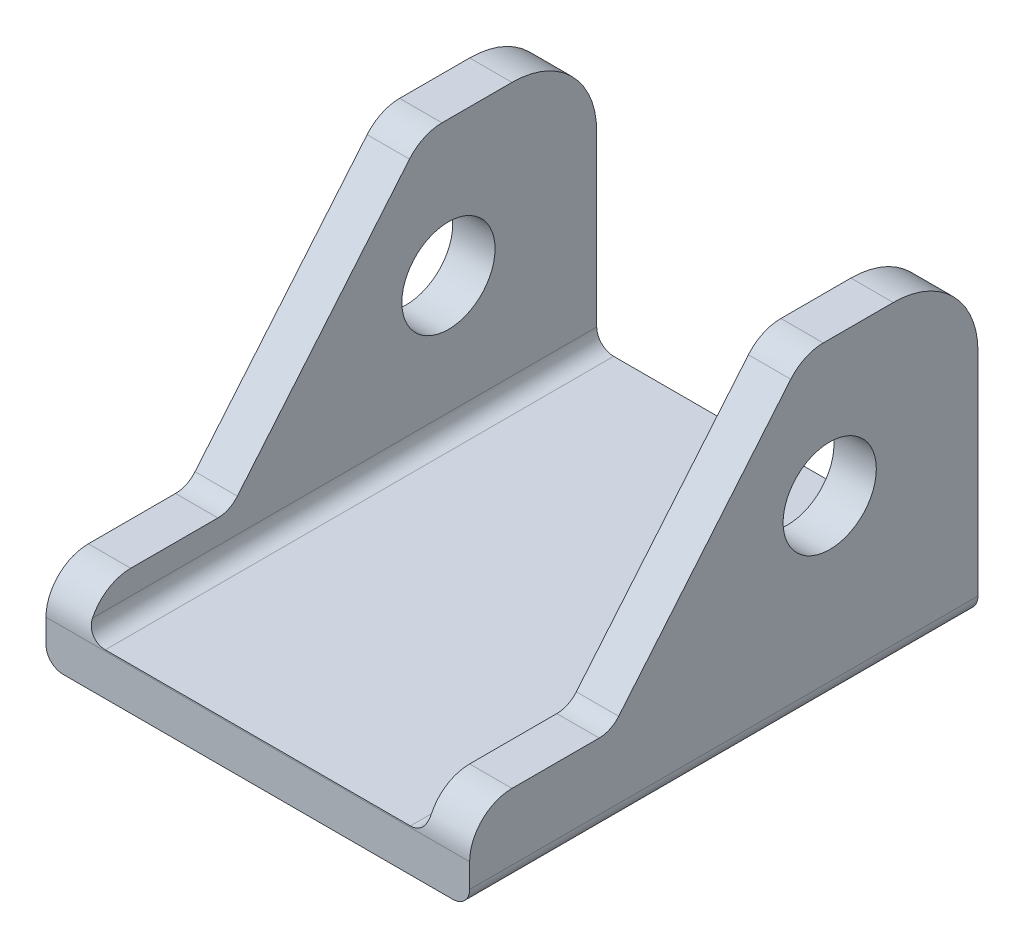
ISO-10303-21;
HEADER;
FILE_DESCRIPTION(('STEP AP214'),'2;1');
FILE_NAME('part.step','',(''),(''),'','','');
FILE_SCHEMA(('AUTOMOTIVE_DESIGN { 1 0 10303 214 1 1 1 1 }'));
ENDSEC;
DATA;
#1=APPLICATION_CONTEXT('core data for automotive mechanical design processes');
#2=APPLICATION_PROTOCOL_DEFINITION('international standard','automotive_design',2000,#1);
#3=PRODUCT_CONTEXT('',#1,'mechanical');
#4=PRODUCT('Part','Part','',(#3));
#5=PRODUCT_RELATED_PRODUCT_CATEGORY('part','',(#4));
#6=PRODUCT_DEFINITION_FORMATION('','',#4);
#7=PRODUCT_DEFINITION_CONTEXT('part definition',#1,'design');
#8=PRODUCT_DEFINITION('design','',#6,#7);
#9=PRODUCT_DEFINITION_SHAPE('','',#8);
#10=(LENGTH_UNIT() NAMED_UNIT(*) SI_UNIT(.MILLI.,.METRE.));
#11=(NAMED_UNIT(*) PLANE_ANGLE_UNIT() SI_UNIT($,.RADIAN.));
#12=(NAMED_UNIT(*) SI_UNIT($,.STERADIAN.) SOLID_ANGLE_UNIT());
#13=UNCERTAINTY_MEASURE_WITH_UNIT(LENGTH_MEASURE(1.E-05),#10,'distance_accuracy_value','');
#14=(GEOMETRIC_REPRESENTATION_CONTEXT(3) GLOBAL_UNCERTAINTY_ASSIGNED_CONTEXT((#13)) GLOBAL_UNIT_ASSIGNED_CONTEXT((#10,
#11,#12)) REPRESENTATION_CONTEXT('',''));
#15=CARTESIAN_POINT('',(0.,0.,0.));
#16=DIRECTION('',(0.,0.,1.));
#17=DIRECTION('',(1.,0.,0.));
#18=AXIS2_PLACEMENT_3D('',#15,#16,#17);
#19=CARTESIAN_POINT('',(-93.9251910485441,-11.2481336624736,60.));
#20=DIRECTION('',(1.,0.,0.));
#21=DIRECTION('',(0.,0.,-1.));
#22=AXIS2_PLACEMENT_3D('',#19,#20,#21);
#23=PLANE('',#22);
#24=CARTESIAN_POINT('',(-93.9251910485441,7.75186633752635,17.5));
#25=DIRECTION('',(1.,0.,0.));
#26=DIRECTION('',(0.,0.,-1.));
#27=AXIS2_PLACEMENT_3D('',#24,#25,#26);
#28=CIRCLE('',#27,5.49999999999999);
#29=CARTESIAN_POINT('',(-93.9251910485441,7.75186633752635,12.));
#30=VERTEX_POINT('',#29);
#31=EDGE_CURVE('E352',#30,#30,#28,.T.);
#32=ORIENTED_EDGE('',*,*,#31,.T.);
#33=EDGE_LOOP('',(#32));
#34=FACE_BOUND('',#33,.T.);
#35=CARTESIAN_POINT('',(-93.9251910485441,18.7518663375264,18.2638664890412));
#36=DIRECTION('',(1.,0.,0.));
#37=DIRECTION('',(0.,0.,-1.));
#38=AXIS2_PLACEMENT_3D('',#35,#36,#37);
#39=CIRCLE('',#38,5.00000000000004);
#40=CARTESIAN_POINT('',(-93.9251910485441,23.7518663375264,18.2638664890412));
#41=VERTEX_POINT('',#40);
#42=CARTESIAN_POINT('',(-93.9251910485441,21.9591391649979,22.0996716209741));
#43=VERTEX_POINT('',#42);
#44=EDGE_CURVE('E346',#41,#43,#39,.T.);
#45=ORIENTED_EDGE('',*,*,#44,.F.);
#46=DIRECTION('',(0.,0.,-1.));
#47=VECTOR('',#46,1.);
#48=CARTESIAN_POINT('',(-93.9251910485441,23.7518663375264,60.));
#49=LINE('',#48,#47);
#50=CARTESIAN_POINT('',(-93.9251910485441,23.7518663375264,10.));
#51=VERTEX_POINT('',#50);
#52=EDGE_CURVE('E427',#41,#51,#49,.T.);
#53=ORIENTED_EDGE('',*,*,#52,.T.);
#54=CARTESIAN_POINT('',(-93.9251910485441,13.7518663375263,10.));
#55=DIRECTION('',(1.,0.,0.));
#56=DIRECTION('',(0.,0.,-1.));
#57=AXIS2_PLACEMENT_3D('',#54,#55,#56);
#58=CIRCLE('',#57,10.);
#59=CARTESIAN_POINT('',(-93.9251910485441,13.7518663375263,0.));
#60=VERTEX_POINT('',#59);
#61=EDGE_CURVE('E325',#51,#60,#58,.F.);
#62=ORIENTED_EDGE('',*,*,#61,.T.);
#63=DIRECTION('',(0.,-1.,0.));
#64=VECTOR('',#63,1.);
#65=CARTESIAN_POINT('',(-93.9251910485441,-11.2481336624736,0.));
#66=LINE('',#65,#64);
#67=CARTESIAN_POINT('',(-93.9251910485441,-11.2481336624737,0.));
#68=VERTEX_POINT('',#67);
#69=EDGE_CURVE('E365',#60,#68,#66,.T.);
#70=ORIENTED_EDGE('',*,*,#69,.T.);
#71=DIRECTION('',(0.,0.,-1.));
#72=VECTOR('',#71,1.);
#73=CARTESIAN_POINT('',(-93.9251910485441,-11.2481336624737,60.));
#74=LINE('',#73,#72);
#75=CARTESIAN_POINT('',(-93.9251910485441,-11.2481336624737,60.));
#76=VERTEX_POINT('',#75);
#77=EDGE_CURVE('E424',#76,#68,#74,.T.);
#78=ORIENTED_EDGE('',*,*,#77,.F.);
#79=DIRECTION('',(0.,-1.,0.));
#80=VECTOR('',#79,1.);
#81=CARTESIAN_POINT('',(-93.9251910485441,-11.2481336624736,60.));
#82=LINE('',#81,#80);
#83=CARTESIAN_POINT('',(-93.9251910485441,-8.40963792703764,60.));
#84=VERTEX_POINT('',#83);
#85=EDGE_CURVE('E366',#84,#76,#82,.T.);
#86=ORIENTED_EDGE('',*,*,#85,.F.);
#87=CARTESIAN_POINT('',(-93.9251910485441,-8.40963792703764,55.));
#88=DIRECTION('',(1.,0.,0.));
#89=DIRECTION('',(0.,0.,-1.));
#90=AXIS2_PLACEMENT_3D('',#87,#88,#89);
#91=CIRCLE('',#90,5.);
#92=CARTESIAN_POINT('',(-93.9251910485441,-3.40963792703763,55.));
#93=VERTEX_POINT('',#92);
#94=EDGE_CURVE('E447',#93,#84,#91,.T.);
#95=ORIENTED_EDGE('',*,*,#94,.F.);
#96=DIRECTION('',(0.,0.,1.));
#97=VECTOR('',#96,1.);
#98=CARTESIAN_POINT('',(-93.9251910485441,-3.40963792703763,60.));
#99=LINE('',#98,#97);
#100=CARTESIAN_POINT('',(-93.9251910485441,-3.40963792703763,44.7136386937328));
#101=VERTEX_POINT('',#100);
#102=EDGE_CURVE('E210',#101,#93,#99,.T.);
#103=ORIENTED_EDGE('',*,*,#102,.F.);
#104=CARTESIAN_POINT('',(-93.9251910485441,-0.409637927037632,44.7136386937328));
#105=DIRECTION('',(1.,0.,0.));
#106=DIRECTION('',(0.,0.,-1.));
#107=AXIS2_PLACEMENT_3D('',#104,#105,#106);
#108=CIRCLE('',#107,3.);
#109=CARTESIAN_POINT('',(-93.9251910485441,-2.33400162352049,42.4121556145731));
#110=VERTEX_POINT('',#109);
#111=EDGE_CURVE('E53',#110,#101,#108,.F.);
#112=ORIENTED_EDGE('',*,*,#111,.F.);
#113=DIRECTION('',(0.,-0.767161026386595,0.641454565494289));
#114=VECTOR('',#113,1.);
#115=CARTESIAN_POINT('',(-93.9251910485441,-16.2352492263773,54.0355546588638));
#116=LINE('',#115,#114);
#117=EDGE_CURVE('E48',#43,#110,#116,.T.);
#118=ORIENTED_EDGE('',*,*,#117,.F.);
#119=EDGE_LOOP('',(#45,#53,#62,#70,#78,#86,#95,#103,#112,#118));
#120=FACE_BOUND('',#119,.T.);
#121=ADVANCED_FACE('F33',(#34,#120),#23,.F.);
#122=CARTESIAN_POINT('',(-43.9251910485441,-11.2481336624736,60.));
#123=DIRECTION('',(-1.,0.,0.));
#124=DIRECTION('',(0.,0.,1.));
#125=AXIS2_PLACEMENT_3D('',#122,#123,#124);
#126=PLANE('',#125);
#127=CARTESIAN_POINT('',(-43.9251910485441,7.75186633752635,17.5));
#128=DIRECTION('',(1.,0.,0.));
#129=DIRECTION('',(0.,0.,-1.));
#130=AXIS2_PLACEMENT_3D('',#127,#128,#129);
#131=CIRCLE('',#130,5.49999999999999);
#132=CARTESIAN_POINT('',(-43.9251910485441,7.75186633752635,12.));
#133=VERTEX_POINT('',#132);
#134=EDGE_CURVE('E348',#133,#133,#131,.T.);
#135=ORIENTED_EDGE('',*,*,#134,.F.);
#136=EDGE_LOOP('',(#135));
#137=FACE_BOUND('',#136,.T.);
#138=CARTESIAN_POINT('',(-43.9251910485441,18.7518663375264,18.2638664890412));
#139=DIRECTION('',(-1.,0.,0.));
#140=DIRECTION('',(0.,0.,1.));
#141=AXIS2_PLACEMENT_3D('',#138,#139,#140);
#142=CIRCLE('',#141,5.00000000000004);
#143=CARTESIAN_POINT('',(-43.9251910485441,21.9591391649979,22.0996716209741));
#144=VERTEX_POINT('',#143);
#145=CARTESIAN_POINT('',(-43.9251910485441,23.7518663375264,18.2638664890412));
#146=VERTEX_POINT('',#145);
#147=EDGE_CURVE('E349',#144,#146,#142,.T.);
#148=ORIENTED_EDGE('',*,*,#147,.F.);
#149=DIRECTION('',(0.,0.767161026386595,-0.641454565494289));
#150=VECTOR('',#149,1.);
#151=CARTESIAN_POINT('',(-43.9251910485441,-16.2352492263773,54.0355546588638));
#152=LINE('',#151,#150);
#153=CARTESIAN_POINT('',(-43.9251910485441,-2.33400162352049,42.4121556145731));
#154=VERTEX_POINT('',#153);
#155=EDGE_CURVE('E467',#154,#144,#152,.T.);
#156=ORIENTED_EDGE('',*,*,#155,.F.);
#157=CARTESIAN_POINT('',(-43.9251910485441,-0.409637927037632,44.7136386937328));
#158=DIRECTION('',(-1.,0.,0.));
#159=DIRECTION('',(0.,0.,1.));
#160=AXIS2_PLACEMENT_3D('',#157,#158,#159);
#161=CIRCLE('',#160,3.);
#162=CARTESIAN_POINT('',(-43.9251910485441,-3.40963792703763,44.7136386937328));
#163=VERTEX_POINT('',#162);
#164=EDGE_CURVE('E460',#163,#154,#161,.F.);
#165=ORIENTED_EDGE('',*,*,#164,.F.);
#166=DIRECTION('',(0.,0.,-1.));
#167=VECTOR('',#166,1.);
#168=CARTESIAN_POINT('',(-43.9251910485441,-3.40963792703763,60.));
#169=LINE('',#168,#167);
#170=CARTESIAN_POINT('',(-43.9251910485441,-3.40963792703763,55.));
#171=VERTEX_POINT('',#170);
#172=EDGE_CURVE('E453',#171,#163,#169,.T.);
#173=ORIENTED_EDGE('',*,*,#172,.F.);
#174=CARTESIAN_POINT('',(-43.9251910485441,-8.40963792703764,55.));
#175=DIRECTION('',(-1.,0.,0.));
#176=DIRECTION('',(0.,0.,1.));
#177=AXIS2_PLACEMENT_3D('',#174,#175,#176);
#178=CIRCLE('',#177,5.);
#179=CARTESIAN_POINT('',(-43.9251910485441,-8.40963792703764,60.));
#180=VERTEX_POINT('',#179);
#181=EDGE_CURVE('E446',#180,#171,#178,.T.);
#182=ORIENTED_EDGE('',*,*,#181,.F.);
#183=DIRECTION('',(0.,1.,0.));
#184=VECTOR('',#183,1.);
#185=CARTESIAN_POINT('',(-43.9251910485441,-11.2481336624736,60.));
#186=LINE('',#185,#184);
#187=CARTESIAN_POINT('',(-43.9251910485441,-11.2481336624736,60.));
#188=VERTEX_POINT('',#187);
#189=EDGE_CURVE('E375',#188,#180,#186,.T.);
#190=ORIENTED_EDGE('',*,*,#189,.F.);
#191=DIRECTION('',(0.,0.,-1.));
#192=VECTOR('',#191,1.);
#193=CARTESIAN_POINT('',(-43.9251910485441,-11.2481336624736,60.));
#194=LINE('',#193,#192);
#195=CARTESIAN_POINT('',(-43.9251910485441,-11.2481336624736,0.));
#196=VERTEX_POINT('',#195);
#197=EDGE_CURVE('E415',#188,#196,#194,.T.);
#198=ORIENTED_EDGE('',*,*,#197,.T.);
#199=DIRECTION('',(0.,1.,0.));
#200=VECTOR('',#199,1.);
#201=CARTESIAN_POINT('',(-43.9251910485441,-11.2481336624736,0.));
#202=LINE('',#201,#200);
#203=CARTESIAN_POINT('',(-43.9251910485441,13.7518663375263,0.));
#204=VERTEX_POINT('',#203);
#205=EDGE_CURVE('E386',#196,#204,#202,.T.);
#206=ORIENTED_EDGE('',*,*,#205,.T.);
#207=CARTESIAN_POINT('',(-43.9251910485441,13.7518663375263,10.));
#208=DIRECTION('',(-1.,0.,0.));
#209=DIRECTION('',(0.,0.,1.));
#210=AXIS2_PLACEMENT_3D('',#207,#208,#209);
#211=CIRCLE('',#210,10.);
#212=CARTESIAN_POINT('',(-43.9251910485441,23.7518663375264,10.));
#213=VERTEX_POINT('',#212);
#214=EDGE_CURVE('E314',#204,#213,#211,.F.);
#215=ORIENTED_EDGE('',*,*,#214,.T.);
#216=DIRECTION('',(0.,0.,-1.));
#217=VECTOR('',#216,1.);
#218=CARTESIAN_POINT('',(-43.9251910485441,23.7518663375264,60.));
#219=LINE('',#218,#217);
#220=EDGE_CURVE('E413',#146,#213,#219,.T.);
#221=ORIENTED_EDGE('',*,*,#220,.F.);
#222=EDGE_LOOP('',(#148,#156,#165,#173,#182,#190,#198,#206,#215,#221));
#223=FACE_BOUND('',#222,.T.);
#224=ADVANCED_FACE('F268',(#137,#223),#126,.F.);
#225=CARTESIAN_POINT('',(-48.9251910485441,-6.24813366247364,60.));
#226=DIRECTION('',(1.,0.,0.));
#227=DIRECTION('',(0.,0.,-1.));
#228=AXIS2_PLACEMENT_3D('',#225,#226,#227);
#229=PLANE('',#228);
#230=CARTESIAN_POINT('',(-48.9251910485441,7.75186633752635,17.5));
#231=DIRECTION('',(1.,0.,0.));
#232=DIRECTION('',(0.,0.,-1.));
#233=AXIS2_PLACEMENT_3D('',#230,#231,#232);
#234=CIRCLE('',#233,5.49999999999999);
#235=CARTESIAN_POINT('',(-48.9251910485441,7.75186633752635,12.));
#236=VERTEX_POINT('',#235);
#237=EDGE_CURVE('E361',#236,#236,#234,.T.);
#238=ORIENTED_EDGE('',*,*,#237,.T.);
#239=EDGE_LOOP('',(#238));
#240=FACE_BOUND('',#239,.T.);
#241=CARTESIAN_POINT('',(-48.9251910485441,18.7518663375264,18.2638664890412));
#242=DIRECTION('',(1.,0.,0.));
#243=DIRECTION('',(0.,0.,-1.));
#244=AXIS2_PLACEMENT_3D('',#241,#242,#243);
#245=CIRCLE('',#244,5.00000000000004);
#246=CARTESIAN_POINT('',(-48.9251910485441,23.7518663375264,18.2638664890412));
#247=VERTEX_POINT('',#246);
#248=CARTESIAN_POINT('',(-48.9251910485441,21.9591391649979,22.0996716209741));
#249=VERTEX_POINT('',#248);
#250=EDGE_CURVE('E355',#247,#249,#245,.T.);
#251=ORIENTED_EDGE('',*,*,#250,.F.);
#252=DIRECTION('',(0.,0.,-1.));
#253=VECTOR('',#252,1.);
#254=CARTESIAN_POINT('',(-48.9251910485441,23.7518663375264,60.));
#255=LINE('',#254,#253);
#256=CARTESIAN_POINT('',(-48.9251910485441,23.7518663375264,10.));
#257=VERTEX_POINT('',#256);
#258=EDGE_CURVE('E411',#247,#257,#255,.T.);
#259=ORIENTED_EDGE('',*,*,#258,.T.);
#260=CARTESIAN_POINT('',(-48.9251910485441,13.7518663375263,10.));
#261=DIRECTION('',(1.,0.,0.));
#262=DIRECTION('',(0.,0.,-1.));
#263=AXIS2_PLACEMENT_3D('',#260,#261,#262);
#264=CIRCLE('',#263,10.);
#265=CARTESIAN_POINT('',(-48.9251910485441,13.7518663375263,0.));
#266=VERTEX_POINT('',#265);
#267=EDGE_CURVE('E327',#257,#266,#264,.F.);
#268=ORIENTED_EDGE('',*,*,#267,.T.);
#269=DIRECTION('',(0.,-1.,0.));
#270=VECTOR('',#269,1.);
#271=CARTESIAN_POINT('',(-48.9251910485441,-6.24813366247364,0.));
#272=LINE('',#271,#270);
#273=CARTESIAN_POINT('',(-48.9251910485441,-6.24813366247365,0.));
#274=VERTEX_POINT('',#273);
#275=EDGE_CURVE('E388',#266,#274,#272,.T.);
#276=ORIENTED_EDGE('',*,*,#275,.T.);
#277=DIRECTION('',(0.,0.,-1.));
#278=VECTOR('',#277,1.);
#279=CARTESIAN_POINT('',(-48.9251910485441,-6.24813366247365,60.));
#280=LINE('',#279,#278);
#281=CARTESIAN_POINT('',(-48.9251910485441,-6.24813366247365,59.5086471711892));
#282=VERTEX_POINT('',#281);
#283=EDGE_CURVE('E409',#282,#274,#280,.T.);
#284=ORIENTED_EDGE('',*,*,#283,.F.);
#285=CARTESIAN_POINT('',(-48.9251910485441,-8.40963792703764,55.));
#286=DIRECTION('',(1.,0.,0.));
#287=DIRECTION('',(0.,0.,-1.));
#288=AXIS2_PLACEMENT_3D('',#285,#286,#287);
#289=CIRCLE('',#288,5.);
#290=CARTESIAN_POINT('',(-48.9251910485441,-3.40963792703763,55.));
#291=VERTEX_POINT('',#290);
#292=EDGE_CURVE('E257',#291,#282,#289,.T.);
#293=ORIENTED_EDGE('',*,*,#292,.F.);
#294=DIRECTION('',(0.,0.,1.));
#295=VECTOR('',#294,1.);
#296=CARTESIAN_POINT('',(-48.9251910485441,-3.40963792703763,60.));
#297=LINE('',#296,#295);
#298=CARTESIAN_POINT('',(-48.9251910485441,-3.40963792703763,44.7136386937328));
#299=VERTEX_POINT('',#298);
#300=EDGE_CURVE('E449',#299,#291,#297,.T.);
#301=ORIENTED_EDGE('',*,*,#300,.F.);
#302=CARTESIAN_POINT('',(-48.9251910485441,-0.409637927037632,44.7136386937328));
#303=DIRECTION('',(1.,0.,0.));
#304=DIRECTION('',(0.,0.,-1.));
#305=AXIS2_PLACEMENT_3D('',#302,#303,#304);
#306=CIRCLE('',#305,3.);
#307=CARTESIAN_POINT('',(-48.9251910485441,-2.33400162352049,42.4121556145731));
#308=VERTEX_POINT('',#307);
#309=EDGE_CURVE('E457',#308,#299,#306,.F.);
#310=ORIENTED_EDGE('',*,*,#309,.F.);
#311=DIRECTION('',(0.,-0.767161026386595,0.641454565494289));
#312=VECTOR('',#311,1.);
#313=CARTESIAN_POINT('',(-48.9251910485441,-13.2925690243447,51.575059944639));
#314=LINE('',#313,#312);
#315=EDGE_CURVE('E464',#249,#308,#314,.T.);
#316=ORIENTED_EDGE('',*,*,#315,.F.);
#317=EDGE_LOOP('',(#251,#259,#268,#276,#284,#293,#301,#310,#316));
#318=FACE_BOUND('',#317,.T.);
#319=ADVANCED_FACE('F264',(#240,#318),#229,.F.);
#320=CARTESIAN_POINT('',(-50.9251910485441,-6.24813366247365,60.));
#321=DIRECTION('',(0.,0.,-1.));
#322=DIRECTION('',(-1.,0.,0.));
#323=AXIS2_PLACEMENT_3D('',#320,#321,#322);
#324=CYLINDRICAL_SURFACE('',#323,2.);
#325=CARTESIAN_POINT('',(-48.9251910485441,-6.24813366247365,59.5086471711892));
#326=CARTESIAN_POINT('',(-48.9251858279574,-6.29925158291446,59.5331623247386));
#327=CARTESIAN_POINT('',(-48.9271512068706,-6.35080301802406,59.5567990272246));
#328=CARTESIAN_POINT('',(-48.9351813542254,-6.4544317763055,59.6022115280821));
#329=CARTESIAN_POINT('',(-48.9412481172607,-6.50650934320252,59.6239864152048));
#330=CARTESIAN_POINT('',(-48.9576482900264,-6.61085446674956,59.6655693990258));
#331=CARTESIAN_POINT('',(-48.9679862513358,-6.66312216693954,59.6853753695408));
#332=CARTESIAN_POINT('',(-48.9930137289147,-6.76733290544826,59.7229131946399));
#333=CARTESIAN_POINT('',(-49.0077024703024,-6.81927599989918,59.7406454177785));
#334=CARTESIAN_POINT('',(-49.0585115706969,-6.97430059994173,59.7907790495721));
#335=CARTESIAN_POINT('',(-49.1013362318181,-7.07632240709126,59.8200169471265));
#336=CARTESIAN_POINT('',(-49.2042792554827,-7.27322030647919,59.8702058638573));
#337=CARTESIAN_POINT('',(-49.2643756509398,-7.36810528350626,59.8911673295423));
#338=CARTESIAN_POINT('',(-49.3970308688227,-7.54279772429905,59.9250504742515));
#339=CARTESIAN_POINT('',(-49.4688265198361,-7.62311873332185,59.9383184475655));
#340=CARTESIAN_POINT('',(-49.6248376640662,-7.77151129368799,59.9596805565257));
#341=CARTESIAN_POINT('',(-49.7090594765108,-7.8395765731386,59.9677720484745));
#342=CARTESIAN_POINT('',(-49.8881051774763,-7.96168873087447,59.9802757420668));
#343=CARTESIAN_POINT('',(-49.982990863911,-8.01564716216324,59.9846650966699));
#344=CARTESIAN_POINT('',(-50.1803233596858,-8.10743722342262,59.9910713392175));
#345=CARTESIAN_POINT('',(-50.2827684441001,-8.14527251915009,59.9930887666271));
#346=CARTESIAN_POINT('',(-50.4749979127183,-8.19891859416786,59.9956202169407));
#347=CARTESIAN_POINT('',(-50.5640614480152,-8.21734265358092,59.9963281951281));
#348=CARTESIAN_POINT('',(-50.7438048210362,-8.24196347177263,59.9971908023903));
#349=CARTESIAN_POINT('',(-50.8344835569718,-8.24816826602773,59.9973457951668));
#350=CARTESIAN_POINT('',(-50.9251910485441,-8.24813366247365,59.997390956542));
#351=B_SPLINE_CURVE_WITH_KNOTS('',3,(#325,#326,#327,#328,#329,#330,#331,#332,#333,#334,#335,
#336,#337,#338,#339,#340,#341,#342,#343,#344,#345,#346,#347,#348,#349,#350),.UNSPECIFIED.,.F.,
.F.,(4,2,2,2,2,2,2,2,2,2,2,2,4),(0.,0.17005031612191,0.340183391021295,0.510498236842748,
0.680782767500137,1.02217120620498,1.3631273564556,1.68722414142514,2.01148631504457,
2.33773526643185,2.66391000221575,2.93594663159866,3.20780430792564),.UNSPECIFIED.);
#352=CARTESIAN_POINT('',(-50.9251910485441,-8.24813366247365,59.997390956542));
#353=VERTEX_POINT('',#352);
#354=EDGE_CURVE('E249',#282,#353,#351,.T.);
#355=ORIENTED_EDGE('',*,*,#354,.F.);
#356=ORIENTED_EDGE('',*,*,#283,.T.);
#357=CARTESIAN_POINT('',(-50.9251910485441,-6.24813366247365,0.));
#358=DIRECTION('',(0.,0.,-1.));
#359=DIRECTION('',(1.,0.,0.));
#360=AXIS2_PLACEMENT_3D('',#357,#358,#359);
#361=CIRCLE('',#360,2.);
#362=CARTESIAN_POINT('',(-50.9251910485441,-8.24813366247365,0.));
#363=VERTEX_POINT('',#362);
#364=EDGE_CURVE('E391',#274,#363,#361,.T.);
#365=ORIENTED_EDGE('',*,*,#364,.T.);
#366=DIRECTION('',(0.,0.,-1.));
#367=VECTOR('',#366,1.);
#368=CARTESIAN_POINT('',(-50.9251910485441,-8.24813366247365,60.));
#369=LINE('',#368,#367);
#370=EDGE_CURVE('E407',#353,#363,#369,.T.);
#371=ORIENTED_EDGE('',*,*,#370,.F.);
#372=EDGE_LOOP('',(#355,#356,#365,#371));
#373=FACE_BOUND('',#372,.T.);
#374=ADVANCED_FACE('F259',(#373),#324,.F.);
#375=CARTESIAN_POINT('',(-86.9251910485441,-8.24813366247365,60.));
#376=DIRECTION('',(0.,-1.,0.));
#377=DIRECTION('',(0.,0.,-1.));
#378=AXIS2_PLACEMENT_3D('',#375,#376,#377);
#379=PLANE('',#378);
#380=DIRECTION('',(1.,0.,0.));
#381=VECTOR('',#380,1.);
#382=CARTESIAN_POINT('',(-201.954411632606,-8.24813366247365,59.997390956542));
#383=LINE('',#382,#381);
#384=CARTESIAN_POINT('',(-86.9251910485441,-8.24813366247365,59.997390956542));
#385=VERTEX_POINT('',#384);
#386=EDGE_CURVE('E237',#353,#385,#383,.F.);
#387=ORIENTED_EDGE('',*,*,#386,.F.);
#388=ORIENTED_EDGE('',*,*,#370,.T.);
#389=DIRECTION('',(-1.,0.,0.));
#390=VECTOR('',#389,1.);
#391=CARTESIAN_POINT('',(-86.9251910485441,-8.24813366247365,0.));
#392=LINE('',#391,#390);
#393=CARTESIAN_POINT('',(-86.9251910485441,-8.24813366247365,0.));
#394=VERTEX_POINT('',#393);
#395=EDGE_CURVE('E394',#363,#394,#392,.T.);
#396=ORIENTED_EDGE('',*,*,#395,.T.);
#397=DIRECTION('',(0.,0.,-1.));
#398=VECTOR('',#397,1.);
#399=CARTESIAN_POINT('',(-86.9251910485441,-8.24813366247365,60.));
#400=LINE('',#399,#398);
#401=EDGE_CURVE('E405',#385,#394,#400,.T.);
#402=ORIENTED_EDGE('',*,*,#401,.F.);
#403=EDGE_LOOP('',(#387,#388,#396,#402));
#404=FACE_BOUND('',#403,.T.);
#405=ADVANCED_FACE('F263',(#404),#379,.F.);
#406=CARTESIAN_POINT('',(-86.9251910485441,-6.24813366247365,60.));
#407=DIRECTION('',(0.,0.,-1.));
#408=DIRECTION('',(-1.,0.,0.));
#409=AXIS2_PLACEMENT_3D('',#406,#407,#408);
#410=CYLINDRICAL_SURFACE('',#409,2.);
#411=CARTESIAN_POINT('',(-86.9251910485441,-8.24813366247365,59.997390956542));
#412=CARTESIAN_POINT('',(-86.9812711668975,-8.24813327190805,59.9973855418156));
#413=CARTESIAN_POINT('',(-87.0373245218461,-8.24577343707318,59.9973152911568));
#414=CARTESIAN_POINT('',(-87.1490332400256,-8.23635895740011,59.9969998076121));
#415=CARTESIAN_POINT('',(-87.2046886155049,-8.22930445768085,59.9967545801349));
#416=CARTESIAN_POINT('',(-87.3704058709195,-8.20115871113855,59.9956893695156));
#417=CARTESIAN_POINT('',(-87.4793630818956,-8.17308507890719,59.9945400739284));
#418=CARTESIAN_POINT('',(-87.6910287339406,-8.09910257991013,59.9904834356634));
#419=CARTESIAN_POINT('',(-87.7937332648341,-8.0531826826677,59.987575005074));
#420=CARTESIAN_POINT('',(-87.9899107151172,-7.94486968668109,59.9786475487793));
#421=CARTESIAN_POINT('',(-88.0833855363495,-7.88247999142165,59.9726291655001));
#422=CARTESIAN_POINT('',(-88.2576426881013,-7.74375261547649,59.9559481940562));
#423=CARTESIAN_POINT('',(-88.338520998429,-7.66753107555153,59.9453233235516));
#424=CARTESIAN_POINT('',(-88.4860987217871,-7.50341577601849,59.9178917468544));
#425=CARTESIAN_POINT('',(-88.5528048122846,-7.41552754521565,59.9010879621928));
#426=CARTESIAN_POINT('',(-88.6688052072329,-7.23360526141879,59.8605965957802));
#427=CARTESIAN_POINT('',(-88.7184987296861,-7.13978401029801,59.8370947007016));
#428=CARTESIAN_POINT('',(-88.8019251200691,-6.94733011365624,59.7824319127128));
#429=CARTESIAN_POINT('',(-88.8356474086825,-6.84869432656981,59.7512659638506));
#430=CARTESIAN_POINT('',(-88.8830580621364,-6.66557519735472,59.6868058543229));
#431=CARTESIAN_POINT('',(-88.8990558800358,-6.58129294880388,59.6546081816976));
#432=CARTESIAN_POINT('',(-88.9148540030958,-6.45555936360914,59.6025686270407));
#433=CARTESIAN_POINT('',(-88.9187537568442,-6.41379567462458,59.5846138397827));
#434=CARTESIAN_POINT('',(-88.9239222189301,-6.33064414444076,59.5475113940815));
#435=CARTESIAN_POINT('',(-88.9251913539991,-6.28925624336692,59.5283639296301));
#436=CARTESIAN_POINT('',(-88.9251910485441,-6.24813366247363,59.5086471711892));
#437=B_SPLINE_CURVE_WITH_KNOTS('',3,(#411,#412,#413,#414,#415,#416,#417,#418,#419,#420,#421,
#422,#423,#424,#425,#426,#427,#428,#429,#430,#431,#432,#433,#434,#435,#436),.UNSPECIFIED.,.F.,
.F.,(4,2,2,2,2,2,2,2,2,2,2,2,4),(0.,0.168137462911748,0.336269728690209,0.672107132004828,
1.00815244175137,1.34412836200262,1.67740380015736,2.01052186032126,2.33517884675307,
2.66005058564638,2.93407719960672,3.07087572360903,3.20765205480597),.UNSPECIFIED.);
#438=CARTESIAN_POINT('',(-88.9251910485441,-6.24813366247364,59.5086471711892));
#439=VERTEX_POINT('',#438);
#440=EDGE_CURVE('E205',#385,#439,#437,.T.);
#441=ORIENTED_EDGE('',*,*,#440,.F.);
#442=ORIENTED_EDGE('',*,*,#401,.T.);
#443=CARTESIAN_POINT('',(-86.9251910485441,-6.24813366247365,0.));
#444=DIRECTION('',(0.,0.,-1.));
#445=DIRECTION('',(-1.,0.,0.));
#446=AXIS2_PLACEMENT_3D('',#443,#444,#445);
#447=CIRCLE('',#446,2.);
#448=CARTESIAN_POINT('',(-88.9251910485441,-6.24813366247364,0.));
#449=VERTEX_POINT('',#448);
#450=EDGE_CURVE('E397',#394,#449,#447,.T.);
#451=ORIENTED_EDGE('',*,*,#450,.T.);
#452=DIRECTION('',(0.,0.,-1.));
#453=VECTOR('',#452,1.);
#454=CARTESIAN_POINT('',(-88.9251910485441,-6.24813366247364,60.));
#455=LINE('',#454,#453);
#456=EDGE_CURVE('E403',#439,#449,#455,.T.);
#457=ORIENTED_EDGE('',*,*,#456,.F.);
#458=EDGE_LOOP('',(#441,#442,#451,#457));
#459=FACE_BOUND('',#458,.T.);
#460=ADVANCED_FACE('F239',(#459),#410,.F.);
#461=CARTESIAN_POINT('',(-88.9251910485441,-6.24813366247364,60.));
#462=DIRECTION('',(-1.,0.,0.));
#463=DIRECTION('',(0.,0.,1.));
#464=AXIS2_PLACEMENT_3D('',#461,#462,#463);
#465=PLANE('',#464);
#466=CARTESIAN_POINT('',(-88.9251910485441,7.75186633752635,17.5));
#467=DIRECTION('',(-1.,0.,0.));
#468=DIRECTION('',(0.,0.,1.));
#469=AXIS2_PLACEMENT_3D('',#466,#467,#468);
#470=CIRCLE('',#469,5.49999999999999);
#471=CARTESIAN_POINT('',(-88.9251910485441,7.75186633752635,23.));
#472=VERTEX_POINT('',#471);
#473=EDGE_CURVE('E362',#472,#472,#470,.T.);
#474=ORIENTED_EDGE('',*,*,#473,.T.);
#475=EDGE_LOOP('',(#474));
#476=FACE_BOUND('',#475,.T.);
#477=CARTESIAN_POINT('',(-88.9251910485441,18.7518663375264,18.2638664890412));
#478=DIRECTION('',(-1.,0.,0.));
#479=DIRECTION('',(0.,0.,1.));
#480=AXIS2_PLACEMENT_3D('',#477,#478,#479);
#481=CIRCLE('',#480,5.00000000000004);
#482=CARTESIAN_POINT('',(-88.9251910485441,21.9591391649979,22.0996716209741));
#483=VERTEX_POINT('',#482);
#484=CARTESIAN_POINT('',(-88.9251910485441,23.7518663375264,18.2638664890412));
#485=VERTEX_POINT('',#484);
#486=EDGE_CURVE('E11',#483,#485,#481,.T.);
#487=ORIENTED_EDGE('',*,*,#486,.F.);
#488=DIRECTION('',(0.,0.767161026386595,-0.641454565494289));
#489=VECTOR('',#488,1.);
#490=CARTESIAN_POINT('',(-88.9251910485441,-13.2925690243447,51.575059944639));
#491=LINE('',#490,#489);
#492=CARTESIAN_POINT('',(-88.9251910485441,-2.33400162352049,42.4121556145731));
#493=VERTEX_POINT('',#492);
#494=EDGE_CURVE('E41',#493,#483,#491,.T.);
#495=ORIENTED_EDGE('',*,*,#494,.F.);
#496=CARTESIAN_POINT('',(-88.9251910485441,-0.409637927037632,44.7136386937328));
#497=DIRECTION('',(-1.,0.,0.));
#498=DIRECTION('',(0.,0.,1.));
#499=AXIS2_PLACEMENT_3D('',#496,#497,#498);
#500=CIRCLE('',#499,3.);
#501=CARTESIAN_POINT('',(-88.9251910485441,-3.40963792703763,44.7136386937328));
#502=VERTEX_POINT('',#501);
#503=EDGE_CURVE('E191',#502,#493,#500,.F.);
#504=ORIENTED_EDGE('',*,*,#503,.F.);
#505=DIRECTION('',(0.,0.,-1.));
#506=VECTOR('',#505,1.);
#507=CARTESIAN_POINT('',(-88.9251910485441,-3.40963792703763,60.));
#508=LINE('',#507,#506);
#509=CARTESIAN_POINT('',(-88.9251910485441,-3.40963792703763,55.));
#510=VERTEX_POINT('',#509);
#511=EDGE_CURVE('E185',#510,#502,#508,.T.);
#512=ORIENTED_EDGE('',*,*,#511,.F.);
#513=CARTESIAN_POINT('',(-88.9251910485441,-8.40963792703764,55.));
#514=DIRECTION('',(-1.,0.,0.));
#515=DIRECTION('',(0.,0.,1.));
#516=AXIS2_PLACEMENT_3D('',#513,#514,#515);
#517=CIRCLE('',#516,5.);
#518=EDGE_CURVE('E188',#439,#510,#517,.T.);
#519=ORIENTED_EDGE('',*,*,#518,.F.);
#520=ORIENTED_EDGE('',*,*,#456,.T.);
#521=DIRECTION('',(0.,1.,0.));
#522=VECTOR('',#521,1.);
#523=CARTESIAN_POINT('',(-88.9251910485441,-6.24813366247364,0.));
#524=LINE('',#523,#522);
#525=CARTESIAN_POINT('',(-88.9251910485441,13.7518663375263,0.));
#526=VERTEX_POINT('',#525);
#527=EDGE_CURVE('E369',#449,#526,#524,.T.);
#528=ORIENTED_EDGE('',*,*,#527,.T.);
#529=CARTESIAN_POINT('',(-88.9251910485441,13.7518663375263,10.));
#530=DIRECTION('',(-1.,0.,0.));
#531=DIRECTION('',(0.,0.,1.));
#532=AXIS2_PLACEMENT_3D('',#529,#530,#531);
#533=CIRCLE('',#532,10.);
#534=CARTESIAN_POINT('',(-88.9251910485441,23.7518663375264,10.));
#535=VERTEX_POINT('',#534);
#536=EDGE_CURVE('E334',#526,#535,#533,.F.);
#537=ORIENTED_EDGE('',*,*,#536,.T.);
#538=DIRECTION('',(0.,0.,-1.));
#539=VECTOR('',#538,1.);
#540=CARTESIAN_POINT('',(-88.9251910485441,23.7518663375264,60.));
#541=LINE('',#540,#539);
#542=EDGE_CURVE('E378',#485,#535,#541,.T.);
#543=ORIENTED_EDGE('',*,*,#542,.F.);
#544=EDGE_LOOP('',(#487,#495,#504,#512,#519,#520,#528,#537,#543));
#545=FACE_BOUND('',#544,.T.);
#546=ADVANCED_FACE('F187',(#476,#545),#465,.F.);
#547=CARTESIAN_POINT('',(-86.9251910485441,-6.24813366247365,60.));
#548=DIRECTION('',(0.,0.,-1.));
#549=DIRECTION('',(-1.,0.,0.));
#550=AXIS2_PLACEMENT_3D('',#547,#548,#549);
#551=PLANE('',#550);
#552=CARTESIAN_POINT('',(-45.9251910485441,-11.2481336624737,60.));
#553=DIRECTION('',(0.,0.,1.));
#554=DIRECTION('',(1.,0.,0.));
#555=AXIS2_PLACEMENT_3D('',#552,#553,#554);
#556=CIRCLE('',#555,2.);
#557=CARTESIAN_POINT('',(-45.9251910485441,-13.2481336624737,60.));
#558=VERTEX_POINT('',#557);
#559=EDGE_CURVE('E373',#558,#188,#556,.T.);
#560=ORIENTED_EDGE('',*,*,#559,.T.);
#561=ORIENTED_EDGE('',*,*,#189,.T.);
#562=DIRECTION('',(1.,0.,0.));
#563=VECTOR('',#562,1.);
#564=CARTESIAN_POINT('',(-201.954411632606,-8.40963792703764,60.0000000000001));
#565=LINE('',#564,#563);
#566=EDGE_CURVE('E196',#84,#180,#565,.T.);
#567=ORIENTED_EDGE('',*,*,#566,.F.);
#568=ORIENTED_EDGE('',*,*,#85,.T.);
#569=CARTESIAN_POINT('',(-91.9251910485441,-11.2481336624737,60.));
#570=DIRECTION('',(0.,0.,1.));
#571=DIRECTION('',(-1.,0.,0.));
#572=AXIS2_PLACEMENT_3D('',#569,#570,#571);
#573=CIRCLE('',#572,2.);
#574=CARTESIAN_POINT('',(-91.9251910485441,-13.2481336624737,60.));
#575=VERTEX_POINT('',#574);
#576=EDGE_CURVE('E368',#76,#575,#573,.T.);
#577=ORIENTED_EDGE('',*,*,#576,.T.);
#578=DIRECTION('',(1.,0.,0.));
#579=VECTOR('',#578,1.);
#580=CARTESIAN_POINT('',(-91.9251910485441,-13.2481336624737,60.));
#581=LINE('',#580,#579);
#582=EDGE_CURVE('E371',#575,#558,#581,.T.);
#583=ORIENTED_EDGE('',*,*,#582,.T.);
#584=EDGE_LOOP('',(#560,#561,#567,#568,#577,#583));
#585=FACE_BOUND('',#584,.T.);
#586=ADVANCED_FACE('F295',(#585),#551,.F.);
#587=CARTESIAN_POINT('',(-93.9251910485441,23.7518663375264,60.));
#588=DIRECTION('',(0.,-1.,0.));
#589=DIRECTION('',(0.,0.,-1.));
#590=AXIS2_PLACEMENT_3D('',#587,#588,#589);
#591=PLANE('',#590);
#592=ORIENTED_EDGE('',*,*,#52,.F.);
#593=DIRECTION('',(1.,0.,0.));
#594=VECTOR('',#593,1.);
#595=CARTESIAN_POINT('',(-201.954411632606,23.7518663375265,18.2638664890412));
#596=LINE('',#595,#594);
#597=EDGE_CURVE('E206',#41,#485,#596,.T.);
#598=ORIENTED_EDGE('',*,*,#597,.T.);
#599=ORIENTED_EDGE('',*,*,#542,.T.);
#600=DIRECTION('',(-1.,0.,0.));
#601=VECTOR('',#600,1.);
#602=CARTESIAN_POINT('',(-93.9251910485441,23.7518663375264,10.));
#603=LINE('',#602,#601);
#604=EDGE_CURVE('E322',#535,#51,#603,.T.);
#605=ORIENTED_EDGE('',*,*,#604,.T.);
#606=EDGE_LOOP('',(#592,#598,#599,#605));
#607=FACE_BOUND('',#606,.T.);
#608=ADVANCED_FACE('F289',(#607),#591,.F.);
#609=CARTESIAN_POINT('',(-91.9251910485441,-11.2481336624737,60.));
#610=DIRECTION('',(0.,0.,-1.));
#611=DIRECTION('',(-1.,0.,0.));
#612=AXIS2_PLACEMENT_3D('',#609,#610,#611);
#613=CYLINDRICAL_SURFACE('',#612,2.);
#614=CARTESIAN_POINT('',(-91.9251910485441,-11.2481336624737,0.));
#615=DIRECTION('',(0.,0.,1.));
#616=DIRECTION('',(-1.,0.,0.));
#617=AXIS2_PLACEMENT_3D('',#614,#615,#616);
#618=CIRCLE('',#617,2.);
#619=CARTESIAN_POINT('',(-91.9251910485441,-13.2481336624737,0.));
#620=VERTEX_POINT('',#619);
#621=EDGE_CURVE('E380',#68,#620,#618,.T.);
#622=ORIENTED_EDGE('',*,*,#621,.T.);
#623=DIRECTION('',(0.,0.,-1.));
#624=VECTOR('',#623,1.);
#625=CARTESIAN_POINT('',(-91.9251910485441,-13.2481336624737,60.));
#626=LINE('',#625,#624);
#627=EDGE_CURVE('E421',#575,#620,#626,.T.);
#628=ORIENTED_EDGE('',*,*,#627,.F.);
#629=ORIENTED_EDGE('',*,*,#576,.F.);
#630=ORIENTED_EDGE('',*,*,#77,.T.);
#631=EDGE_LOOP('',(#622,#628,#629,#630));
#632=FACE_BOUND('',#631,.T.);
#633=ADVANCED_FACE('F285',(#632),#613,.T.);
#634=CARTESIAN_POINT('',(-91.9251910485441,-13.2481336624737,60.));
#635=DIRECTION('',(0.,1.,0.));
#636=DIRECTION('',(0.,0.,1.));
#637=AXIS2_PLACEMENT_3D('',#634,#635,#636);
#638=PLANE('',#637);
#639=DIRECTION('',(1.,0.,0.));
#640=VECTOR('',#639,1.);
#641=CARTESIAN_POINT('',(-91.9251910485441,-13.2481336624737,0.));
#642=LINE('',#641,#640);
#643=CARTESIAN_POINT('',(-45.9251910485441,-13.2481336624737,0.));
#644=VERTEX_POINT('',#643);
#645=EDGE_CURVE('E382',#620,#644,#642,.T.);
#646=ORIENTED_EDGE('',*,*,#645,.T.);
#647=DIRECTION('',(0.,0.,-1.));
#648=VECTOR('',#647,1.);
#649=CARTESIAN_POINT('',(-45.9251910485441,-13.2481336624737,60.));
#650=LINE('',#649,#648);
#651=EDGE_CURVE('E418',#558,#644,#650,.T.);
#652=ORIENTED_EDGE('',*,*,#651,.F.);
#653=ORIENTED_EDGE('',*,*,#582,.F.);
#654=ORIENTED_EDGE('',*,*,#627,.T.);
#655=EDGE_LOOP('',(#646,#652,#653,#654));
#656=FACE_BOUND('',#655,.T.);
#657=ADVANCED_FACE('F281',(#656),#638,.F.);
#658=CARTESIAN_POINT('',(-45.9251910485441,-11.2481336624737,60.));
#659=DIRECTION('',(0.,0.,-1.));
#660=DIRECTION('',(-1.,0.,0.));
#661=AXIS2_PLACEMENT_3D('',#658,#659,#660);
#662=CYLINDRICAL_SURFACE('',#661,2.);
#663=CARTESIAN_POINT('',(-45.9251910485441,-11.2481336624737,0.));
#664=DIRECTION('',(0.,0.,1.));
#665=DIRECTION('',(1.,0.,0.));
#666=AXIS2_PLACEMENT_3D('',#663,#664,#665);
#667=CIRCLE('',#666,2.);
#668=EDGE_CURVE('E384',#644,#196,#667,.T.);
#669=ORIENTED_EDGE('',*,*,#668,.T.);
#670=ORIENTED_EDGE('',*,*,#197,.F.);
#671=ORIENTED_EDGE('',*,*,#559,.F.);
#672=ORIENTED_EDGE('',*,*,#651,.T.);
#673=EDGE_LOOP('',(#669,#670,#671,#672));
#674=FACE_BOUND('',#673,.T.);
#675=ADVANCED_FACE('F274',(#674),#662,.T.);
#676=CARTESIAN_POINT('',(-48.9251910485441,23.7518663375264,60.));
#677=DIRECTION('',(0.,-1.,0.));
#678=DIRECTION('',(0.,0.,-1.));
#679=AXIS2_PLACEMENT_3D('',#676,#677,#678);
#680=PLANE('',#679);
#681=ORIENTED_EDGE('',*,*,#258,.F.);
#682=EDGE_CURVE('E228',#247,#146,#596,.T.);
#683=ORIENTED_EDGE('',*,*,#682,.T.);
#684=ORIENTED_EDGE('',*,*,#220,.T.);
#685=DIRECTION('',(-1.,0.,0.));
#686=VECTOR('',#685,1.);
#687=CARTESIAN_POINT('',(-48.9251910485441,23.7518663375264,10.));
#688=LINE('',#687,#686);
#689=EDGE_CURVE('E318',#213,#257,#688,.T.);
#690=ORIENTED_EDGE('',*,*,#689,.T.);
#691=EDGE_LOOP('',(#681,#683,#684,#690));
#692=FACE_BOUND('',#691,.T.);
#693=ADVANCED_FACE('F270',(#692),#680,.F.);
#694=CARTESIAN_POINT('',(-86.9251910485441,-6.24813366247365,0.));
#695=DIRECTION('',(0.,0.,-1.));
#696=DIRECTION('',(-1.,0.,0.));
#697=AXIS2_PLACEMENT_3D('',#694,#695,#696);
#698=PLANE('',#697);
#699=ORIENTED_EDGE('',*,*,#69,.F.);
#700=DIRECTION('',(-1.,0.,0.));
#701=VECTOR('',#700,1.);
#702=CARTESIAN_POINT('',(-88.9251910485441,13.7518663375263,0.));
#703=LINE('',#702,#701);
#704=EDGE_CURVE('E332',#60,#526,#703,.F.);
#705=ORIENTED_EDGE('',*,*,#704,.T.);
#706=ORIENTED_EDGE('',*,*,#527,.F.);
#707=ORIENTED_EDGE('',*,*,#450,.F.);
#708=ORIENTED_EDGE('',*,*,#395,.F.);
#709=ORIENTED_EDGE('',*,*,#364,.F.);
#710=ORIENTED_EDGE('',*,*,#275,.F.);
#711=DIRECTION('',(-1.,0.,0.));
#712=VECTOR('',#711,1.);
#713=CARTESIAN_POINT('',(-43.9251910485441,13.7518663375263,0.));
#714=LINE('',#713,#712);
#715=EDGE_CURVE('E316',#266,#204,#714,.F.);
#716=ORIENTED_EDGE('',*,*,#715,.T.);
#717=ORIENTED_EDGE('',*,*,#205,.F.);
#718=ORIENTED_EDGE('',*,*,#668,.F.);
#719=ORIENTED_EDGE('',*,*,#645,.F.);
#720=ORIENTED_EDGE('',*,*,#621,.F.);
#721=EDGE_LOOP('',(#699,#705,#706,#707,#708,#709,#710,#716,#717,#718,#719,#720));
#722=FACE_BOUND('',#721,.T.);
#723=ADVANCED_FACE('F273',(#722),#698,.T.);
#724=CARTESIAN_POINT('',(-43.9251910485441,7.75186633752635,17.5));
#725=DIRECTION('',(1.,0.,0.));
#726=DIRECTION('',(0.,0.,-1.));
#727=AXIS2_PLACEMENT_3D('',#724,#725,#726);
#728=CYLINDRICAL_SURFACE('',#727,5.49999999999999);
#729=ORIENTED_EDGE('',*,*,#134,.T.);
#730=EDGE_LOOP('',(#729));
#731=FACE_BOUND('',#730,.T.);
#732=ORIENTED_EDGE('',*,*,#237,.F.);
#733=EDGE_LOOP('',(#732));
#734=FACE_BOUND('',#733,.T.);
#735=ADVANCED_FACE('F307',(#731,#734),#728,.F.);
#736=ORIENTED_EDGE('',*,*,#31,.F.);
#737=EDGE_LOOP('',(#736));
#738=FACE_BOUND('',#737,.T.);
#739=ORIENTED_EDGE('',*,*,#473,.F.);
#740=EDGE_LOOP('',(#739));
#741=FACE_BOUND('',#740,.T.);
#742=ADVANCED_FACE('F299',(#738,#741),#728,.F.);
#743=CARTESIAN_POINT('',(-48.9251910485441,13.7518663375263,10.));
#744=DIRECTION('',(1.,0.,0.));
#745=DIRECTION('',(0.,0.,-1.));
#746=AXIS2_PLACEMENT_3D('',#743,#744,#745);
#747=CYLINDRICAL_SURFACE('',#746,10.);
#748=ORIENTED_EDGE('',*,*,#214,.F.);
#749=ORIENTED_EDGE('',*,*,#715,.F.);
#750=ORIENTED_EDGE('',*,*,#267,.F.);
#751=ORIENTED_EDGE('',*,*,#689,.F.);
#752=EDGE_LOOP('',(#748,#749,#750,#751));
#753=FACE_BOUND('',#752,.T.);
#754=ADVANCED_FACE('F297',(#753),#747,.T.);
#755=CARTESIAN_POINT('',(-93.9251910485441,13.7518663375263,10.));
#756=DIRECTION('',(1.,0.,0.));
#757=DIRECTION('',(0.,0.,-1.));
#758=AXIS2_PLACEMENT_3D('',#755,#756,#757);
#759=CYLINDRICAL_SURFACE('',#758,10.);
#760=ORIENTED_EDGE('',*,*,#536,.F.);
#761=ORIENTED_EDGE('',*,*,#704,.F.);
#762=ORIENTED_EDGE('',*,*,#61,.F.);
#763=ORIENTED_EDGE('',*,*,#604,.F.);
#764=EDGE_LOOP('',(#760,#761,#762,#763));
#765=FACE_BOUND('',#764,.T.);
#766=ADVANCED_FACE('F35',(#765),#759,.T.);
#767=CARTESIAN_POINT('',(-201.954411632606,18.7518663375264,18.2638664890412));
#768=DIRECTION('',(1.,0.,0.));
#769=DIRECTION('',(0.,0.,-1.));
#770=AXIS2_PLACEMENT_3D('',#767,#768,#769);
#771=CYLINDRICAL_SURFACE('',#770,5.00000000000004);
#772=ORIENTED_EDGE('',*,*,#597,.F.);
#773=ORIENTED_EDGE('',*,*,#44,.T.);
#774=DIRECTION('',(1.,0.,0.));
#775=VECTOR('',#774,1.);
#776=CARTESIAN_POINT('',(-201.954411632606,21.9591391649979,22.0996716209742));
#777=LINE('',#776,#775);
#778=EDGE_CURVE('E227',#43,#483,#777,.T.);
#779=ORIENTED_EDGE('',*,*,#778,.T.);
#780=ORIENTED_EDGE('',*,*,#486,.T.);
#781=EDGE_LOOP('',(#772,#773,#779,#780));
#782=FACE_BOUND('',#781,.T.);
#783=ADVANCED_FACE('F305',(#782),#771,.T.);
#784=EDGE_CURVE('E224',#249,#144,#777,.T.);
#785=ORIENTED_EDGE('',*,*,#784,.T.);
#786=ORIENTED_EDGE('',*,*,#147,.T.);
#787=ORIENTED_EDGE('',*,*,#682,.F.);
#788=ORIENTED_EDGE('',*,*,#250,.T.);
#789=EDGE_LOOP('',(#785,#786,#787,#788));
#790=FACE_BOUND('',#789,.T.);
#791=ADVANCED_FACE('F474',(#790),#771,.T.);
#792=CARTESIAN_POINT('',(-201.954411632606,21.9591391649979,22.0996716209741));
#793=DIRECTION('',(0.,0.641454565494289,0.767161026386595));
#794=DIRECTION('',(0.,-0.767161026386595,0.641454565494289));
#795=AXIS2_PLACEMENT_3D('',#792,#793,#794);
#796=PLANE('',#795);
#797=ORIENTED_EDGE('',*,*,#778,.F.);
#798=ORIENTED_EDGE('',*,*,#117,.T.);
#799=DIRECTION('',(1.,0.,0.));
#800=VECTOR('',#799,1.);
#801=CARTESIAN_POINT('',(-201.954411632606,-2.33400162352049,42.4121556145731));
#802=LINE('',#801,#800);
#803=EDGE_CURVE('E223',#110,#493,#802,.T.);
#804=ORIENTED_EDGE('',*,*,#803,.T.);
#805=ORIENTED_EDGE('',*,*,#494,.T.);
#806=EDGE_LOOP('',(#797,#798,#804,#805));
#807=FACE_BOUND('',#806,.T.);
#808=ADVANCED_FACE('F342',(#807),#796,.T.);
#809=EDGE_CURVE('E220',#308,#154,#802,.T.);
#810=ORIENTED_EDGE('',*,*,#809,.T.);
#811=ORIENTED_EDGE('',*,*,#155,.T.);
#812=ORIENTED_EDGE('',*,*,#784,.F.);
#813=ORIENTED_EDGE('',*,*,#315,.T.);
#814=EDGE_LOOP('',(#810,#811,#812,#813));
#815=FACE_BOUND('',#814,.T.);
#816=ADVANCED_FACE('F476',(#815),#796,.T.);
#817=CARTESIAN_POINT('',(-201.954411632606,-0.409637927037632,44.7136386937328));
#818=DIRECTION('',(1.,0.,0.));
#819=DIRECTION('',(0.,0.,-1.));
#820=AXIS2_PLACEMENT_3D('',#817,#818,#819);
#821=CYLINDRICAL_SURFACE('',#820,3.);
#822=ORIENTED_EDGE('',*,*,#803,.F.);
#823=ORIENTED_EDGE('',*,*,#111,.T.);
#824=DIRECTION('',(1.,0.,0.));
#825=VECTOR('',#824,1.);
#826=CARTESIAN_POINT('',(-201.954411632606,-3.40963792703763,44.7136386937328));
#827=LINE('',#826,#825);
#828=EDGE_CURVE('E215',#101,#502,#827,.T.);
#829=ORIENTED_EDGE('',*,*,#828,.T.);
#830=ORIENTED_EDGE('',*,*,#503,.T.);
#831=EDGE_LOOP('',(#822,#823,#829,#830));
#832=FACE_BOUND('',#831,.T.);
#833=ADVANCED_FACE('F522',(#832),#821,.F.);
#834=EDGE_CURVE('E211',#299,#163,#827,.T.);
#835=ORIENTED_EDGE('',*,*,#834,.T.);
#836=ORIENTED_EDGE('',*,*,#164,.T.);
#837=ORIENTED_EDGE('',*,*,#809,.F.);
#838=ORIENTED_EDGE('',*,*,#309,.T.);
#839=EDGE_LOOP('',(#835,#836,#837,#838));
#840=FACE_BOUND('',#839,.T.);
#841=ADVANCED_FACE('F479',(#840),#821,.F.);
#842=CARTESIAN_POINT('',(-201.954411632606,-3.40963792703763,44.7136386937328));
#843=DIRECTION('',(0.,1.,0.));
#844=DIRECTION('',(0.,0.,1.));
#845=AXIS2_PLACEMENT_3D('',#842,#843,#844);
#846=PLANE('',#845);
#847=ORIENTED_EDGE('',*,*,#828,.F.);
#848=ORIENTED_EDGE('',*,*,#102,.T.);
#849=DIRECTION('',(1.,0.,0.));
#850=VECTOR('',#849,1.);
#851=CARTESIAN_POINT('',(-201.954411632606,-3.40963792703763,55.));
#852=LINE('',#851,#850);
#853=EDGE_CURVE('E203',#93,#510,#852,.T.);
#854=ORIENTED_EDGE('',*,*,#853,.T.);
#855=ORIENTED_EDGE('',*,*,#511,.T.);
#856=EDGE_LOOP('',(#847,#848,#854,#855));
#857=FACE_BOUND('',#856,.T.);
#858=ADVANCED_FACE('F209',(#857),#846,.T.);
#859=EDGE_CURVE('E212',#291,#171,#852,.T.);
#860=ORIENTED_EDGE('',*,*,#859,.T.);
#861=ORIENTED_EDGE('',*,*,#172,.T.);
#862=ORIENTED_EDGE('',*,*,#834,.F.);
#863=ORIENTED_EDGE('',*,*,#300,.T.);
#864=EDGE_LOOP('',(#860,#861,#862,#863));
#865=FACE_BOUND('',#864,.T.);
#866=ADVANCED_FACE('F246',(#865),#846,.T.);
#867=CARTESIAN_POINT('',(-201.954411632606,-8.40963792703764,55.));
#868=DIRECTION('',(1.,0.,0.));
#869=DIRECTION('',(0.,0.,-1.));
#870=AXIS2_PLACEMENT_3D('',#867,#868,#869);
#871=CYLINDRICAL_SURFACE('',#870,5.);
#872=ORIENTED_EDGE('',*,*,#853,.F.);
#873=ORIENTED_EDGE('',*,*,#94,.T.);
#874=ORIENTED_EDGE('',*,*,#566,.T.);
#875=ORIENTED_EDGE('',*,*,#181,.T.);
#876=ORIENTED_EDGE('',*,*,#859,.F.);
#877=ORIENTED_EDGE('',*,*,#292,.T.);
#878=ORIENTED_EDGE('',*,*,#354,.T.);
#879=ORIENTED_EDGE('',*,*,#386,.T.);
#880=ORIENTED_EDGE('',*,*,#440,.T.);
#881=ORIENTED_EDGE('',*,*,#518,.T.);
#882=EDGE_LOOP('',(#872,#873,#874,#875,#876,#877,#878,#879,#880,#881));
#883=FACE_BOUND('',#882,.T.);
#884=ADVANCED_FACE('F201',(#883),#871,.T.);
#885=CLOSED_SHELL('',(#121,#224,#319,#374,#405,#460,#546,#586,#608,#633,#657,#675,#693,#723,
#735,#742,#754,#766,#783,#791,#808,#816,#833,#841,#858,#866,#884));
#886=MANIFOLD_SOLID_BREP('B2',#885);
#887=ADVANCED_BREP_SHAPE_REPRESENTATION('',(#18,#886),#14);
#888=SHAPE_DEFINITION_REPRESENTATION(#9,#887);
ENDSEC;
END-ISO-10303-21;
